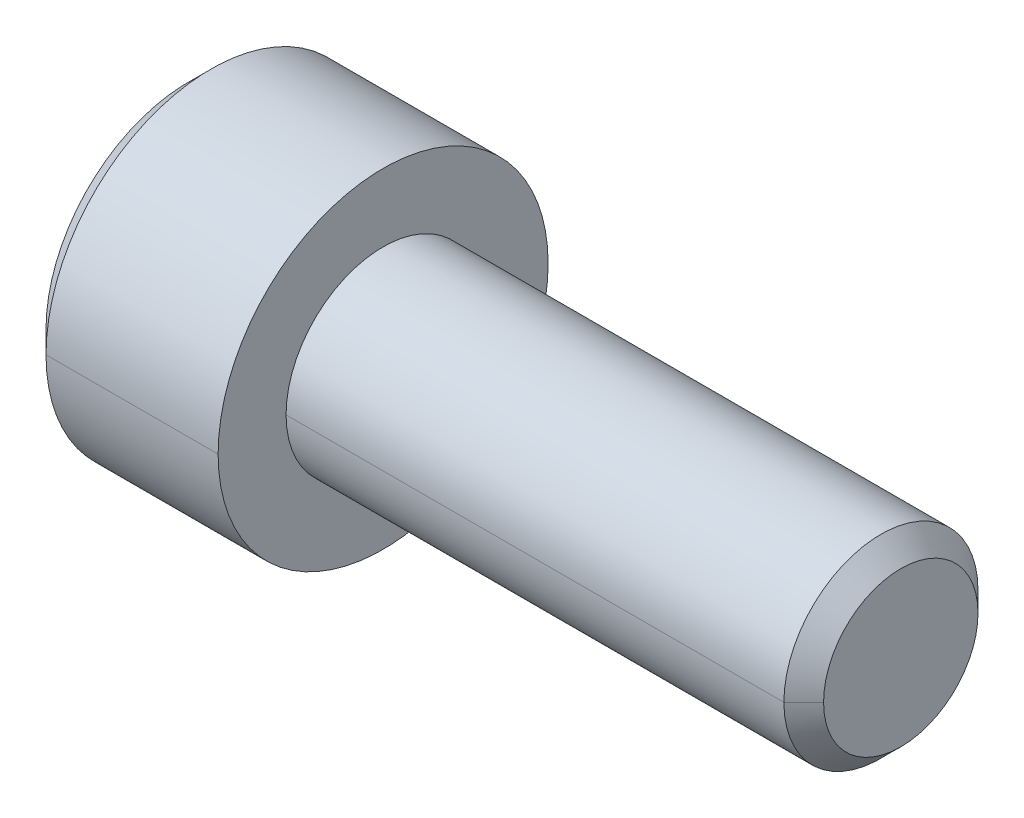
ISO-10303-21;
HEADER;
FILE_DESCRIPTION(('STEP AP214'),'2;1');
FILE_NAME('part.step','',(''),(''),'','','');
FILE_SCHEMA(('AUTOMOTIVE_DESIGN { 1 0 10303 214 1 1 1 1 }'));
ENDSEC;
DATA;
#1=APPLICATION_CONTEXT('core data for automotive mechanical design processes');
#2=APPLICATION_PROTOCOL_DEFINITION('international standard','automotive_design',2000,#1);
#3=PRODUCT_CONTEXT('',#1,'mechanical');
#4=PRODUCT('Part','Part','',(#3));
#5=PRODUCT_RELATED_PRODUCT_CATEGORY('part','',(#4));
#6=PRODUCT_DEFINITION_FORMATION('','',#4);
#7=PRODUCT_DEFINITION_CONTEXT('part definition',#1,'design');
#8=PRODUCT_DEFINITION('design','',#6,#7);
#9=PRODUCT_DEFINITION_SHAPE('','',#8);
#10=(LENGTH_UNIT() NAMED_UNIT(*) SI_UNIT(.MILLI.,.METRE.));
#11=(NAMED_UNIT(*) PLANE_ANGLE_UNIT() SI_UNIT($,.RADIAN.));
#12=(NAMED_UNIT(*) SI_UNIT($,.STERADIAN.) SOLID_ANGLE_UNIT());
#13=UNCERTAINTY_MEASURE_WITH_UNIT(LENGTH_MEASURE(1.E-05),#10,'distance_accuracy_value','');
#14=(GEOMETRIC_REPRESENTATION_CONTEXT(3) GLOBAL_UNCERTAINTY_ASSIGNED_CONTEXT((#13)) GLOBAL_UNIT_ASSIGNED_CONTEXT((#10,
#11,#12)) REPRESENTATION_CONTEXT('',''));
#15=CARTESIAN_POINT('',(0.,0.,0.));
#16=DIRECTION('',(0.,0.,1.));
#17=DIRECTION('',(1.,0.,0.));
#18=AXIS2_PLACEMENT_3D('',#15,#16,#17);
#19=CARTESIAN_POINT('',(-6.,0.,0.));
#20=DIRECTION('',(1.,0.,0.));
#21=DIRECTION('',(0.,0.,-1.));
#22=AXIS2_PLACEMENT_3D('',#19,#20,#21);
#23=PLANE('',#22);
#24=CARTESIAN_POINT('',(-6.,0.,0.));
#25=DIRECTION('',(1.,0.,0.));
#26=DIRECTION('',(0.,0.,-1.));
#27=AXIS2_PLACEMENT_3D('',#24,#25,#26);
#28=CIRCLE('',#27,4.42);
#29=CARTESIAN_POINT('',(-6.,0.,4.42));
#30=VERTEX_POINT('',#29);
#31=CARTESIAN_POINT('',(-6.,0.,-4.42));
#32=VERTEX_POINT('',#31);
#33=EDGE_CURVE('E11',#30,#32,#28,.T.);
#34=ORIENTED_EDGE('',*,*,#33,.F.);
#35=CARTESIAN_POINT('',(-6.,0.,0.));
#36=DIRECTION('',(1.,0.,0.));
#37=DIRECTION('',(0.,0.,-1.));
#38=AXIS2_PLACEMENT_3D('',#35,#36,#37);
#39=CIRCLE('',#38,4.42);
#40=EDGE_CURVE('E25',#32,#30,#39,.T.);
#41=ORIENTED_EDGE('',*,*,#40,.F.);
#42=EDGE_LOOP('',(#34,#41));
#43=FACE_BOUND('',#42,.T.);
#44=DIRECTION('',(0.,0.499999999999983,-0.866025403784448));
#45=VECTOR('',#44,1.);
#46=CARTESIAN_POINT('',(-6.,-2.8867513459481,0.));
#47=LINE('',#46,#45);
#48=CARTESIAN_POINT('',(-6.,-2.8867513459481,0.));
#49=VERTEX_POINT('',#48);
#50=CARTESIAN_POINT('',(-6.,-1.4433756729741,-2.5));
#51=VERTEX_POINT('',#50);
#52=EDGE_CURVE('E353',#49,#51,#47,.T.);
#53=ORIENTED_EDGE('',*,*,#52,.T.);
#54=DIRECTION('',(0.,1.,0.));
#55=VECTOR('',#54,1.);
#56=CARTESIAN_POINT('',(-6.,-1.4433756729741,-2.5));
#57=LINE('',#56,#55);
#58=CARTESIAN_POINT('',(-6.,1.4433756729741,-2.5));
#59=VERTEX_POINT('',#58);
#60=EDGE_CURVE('E349',#51,#59,#57,.T.);
#61=ORIENTED_EDGE('',*,*,#60,.T.);
#62=DIRECTION('',(0.,0.499999999999983,0.866025403784448));
#63=VECTOR('',#62,1.);
#64=CARTESIAN_POINT('',(-6.,1.4433756729741,-2.5));
#65=LINE('',#64,#63);
#66=CARTESIAN_POINT('',(-6.,2.8867513459481,0.));
#67=VERTEX_POINT('',#66);
#68=EDGE_CURVE('E345',#59,#67,#65,.T.);
#69=ORIENTED_EDGE('',*,*,#68,.T.);
#70=DIRECTION('',(0.,-0.499999999999983,0.866025403784448));
#71=VECTOR('',#70,1.);
#72=CARTESIAN_POINT('',(-6.,2.8867513459481,0.));
#73=LINE('',#72,#71);
#74=CARTESIAN_POINT('',(-6.,1.4433756729741,2.5));
#75=VERTEX_POINT('',#74);
#76=EDGE_CURVE('E341',#67,#75,#73,.T.);
#77=ORIENTED_EDGE('',*,*,#76,.T.);
#78=DIRECTION('',(0.,-1.,0.));
#79=VECTOR('',#78,1.);
#80=CARTESIAN_POINT('',(-6.,1.4433756729741,2.5));
#81=LINE('',#80,#79);
#82=CARTESIAN_POINT('',(-6.,-1.4433756729741,2.5));
#83=VERTEX_POINT('',#82);
#84=EDGE_CURVE('E337',#75,#83,#81,.T.);
#85=ORIENTED_EDGE('',*,*,#84,.T.);
#86=DIRECTION('',(0.,-0.499999999999983,-0.866025403784448));
#87=VECTOR('',#86,1.);
#88=CARTESIAN_POINT('',(-6.,-1.4433756729741,2.5));
#89=LINE('',#88,#87);
#90=EDGE_CURVE('E333',#83,#49,#89,.T.);
#91=ORIENTED_EDGE('',*,*,#90,.T.);
#92=EDGE_LOOP('',(#53,#61,#69,#77,#85,#91));
#93=FACE_BOUND('',#92,.T.);
#94=ADVANCED_FACE('F17',(#43,#93),#23,.F.);
#95=CARTESIAN_POINT('',(-3.,-1.4433756729741,2.5));
#96=DIRECTION('',(0.,0.866025403784449,-0.499999999999983));
#97=DIRECTION('',(0.,0.499999999999983,0.866025403784449));
#98=AXIS2_PLACEMENT_3D('',#95,#96,#97);
#99=PLANE('',#98);
#100=ORIENTED_EDGE('',*,*,#90,.F.);
#101=DIRECTION('',(-1.,0.,0.));
#102=VECTOR('',#101,1.);
#103=CARTESIAN_POINT('',(-3.,-1.4433756729741,2.5));
#104=LINE('',#103,#102);
#105=CARTESIAN_POINT('',(-3.,-1.4433756729741,2.5));
#106=VERTEX_POINT('',#105);
#107=EDGE_CURVE('E328',#106,#83,#104,.T.);
#108=ORIENTED_EDGE('',*,*,#107,.F.);
#109=DIRECTION('',(0.,-0.499999999999983,-0.866025403784448));
#110=VECTOR('',#109,1.);
#111=CARTESIAN_POINT('',(-3.,-1.4433756729741,2.5));
#112=LINE('',#111,#110);
#113=CARTESIAN_POINT('',(-3.,-2.16506350946112,1.24999999999996));
#114=VERTEX_POINT('',#113);
#115=EDGE_CURVE('E324',#106,#114,#112,.T.);
#116=ORIENTED_EDGE('',*,*,#115,.T.);
#117=DIRECTION('',(0.,-0.499999999999983,-0.866025403784448));
#118=VECTOR('',#117,1.);
#119=CARTESIAN_POINT('',(-3.,-1.4433756729741,2.5));
#120=LINE('',#119,#118);
#121=CARTESIAN_POINT('',(-3.,-2.8867513459481,0.));
#122=VERTEX_POINT('',#121);
#123=EDGE_CURVE('E320',#114,#122,#120,.T.);
#124=ORIENTED_EDGE('',*,*,#123,.T.);
#125=DIRECTION('',(-1.,0.,0.));
#126=VECTOR('',#125,1.);
#127=CARTESIAN_POINT('',(-3.,-2.8867513459481,0.));
#128=LINE('',#127,#126);
#129=EDGE_CURVE('E315',#122,#49,#128,.T.);
#130=ORIENTED_EDGE('',*,*,#129,.T.);
#131=EDGE_LOOP('',(#100,#108,#116,#124,#130));
#132=FACE_BOUND('',#131,.T.);
#133=ADVANCED_FACE('F387',(#132),#99,.T.);
#134=CARTESIAN_POINT('',(-3.,-2.8867513459481,0.));
#135=DIRECTION('',(0.,0.866025403784449,0.499999999999983));
#136=DIRECTION('',(0.,-0.499999999999983,0.866025403784449));
#137=AXIS2_PLACEMENT_3D('',#134,#135,#136);
#138=PLANE('',#137);
#139=ORIENTED_EDGE('',*,*,#52,.F.);
#140=ORIENTED_EDGE('',*,*,#129,.F.);
#141=DIRECTION('',(0.,0.499999999999983,-0.866025403784448));
#142=VECTOR('',#141,1.);
#143=CARTESIAN_POINT('',(-3.,-2.8867513459481,0.));
#144=LINE('',#143,#142);
#145=CARTESIAN_POINT('',(-3.,-2.16506350946112,-1.24999999999996));
#146=VERTEX_POINT('',#145);
#147=EDGE_CURVE('E311',#122,#146,#144,.T.);
#148=ORIENTED_EDGE('',*,*,#147,.T.);
#149=DIRECTION('',(0.,0.499999999999983,-0.866025403784448));
#150=VECTOR('',#149,1.);
#151=CARTESIAN_POINT('',(-3.,-2.8867513459481,0.));
#152=LINE('',#151,#150);
#153=CARTESIAN_POINT('',(-3.,-1.4433756729741,-2.5));
#154=VERTEX_POINT('',#153);
#155=EDGE_CURVE('E307',#146,#154,#152,.T.);
#156=ORIENTED_EDGE('',*,*,#155,.T.);
#157=DIRECTION('',(-1.,0.,0.));
#158=VECTOR('',#157,1.);
#159=CARTESIAN_POINT('',(-3.,-1.4433756729741,-2.5));
#160=LINE('',#159,#158);
#161=EDGE_CURVE('E302',#154,#51,#160,.T.);
#162=ORIENTED_EDGE('',*,*,#161,.T.);
#163=EDGE_LOOP('',(#139,#140,#148,#156,#162));
#164=FACE_BOUND('',#163,.T.);
#165=ADVANCED_FACE('F391',(#164),#138,.T.);
#166=CARTESIAN_POINT('',(-3.,-1.4433756729741,-2.5));
#167=DIRECTION('',(0.,0.,1.));
#168=DIRECTION('',(1.,0.,0.));
#169=AXIS2_PLACEMENT_3D('',#166,#167,#168);
#170=PLANE('',#169);
#171=ORIENTED_EDGE('',*,*,#60,.F.);
#172=ORIENTED_EDGE('',*,*,#161,.F.);
#173=DIRECTION('',(0.,1.,0.));
#174=VECTOR('',#173,1.);
#175=CARTESIAN_POINT('',(-3.,-1.4433756729741,-2.5));
#176=LINE('',#175,#174);
#177=CARTESIAN_POINT('',(-3.,0.,-2.5));
#178=VERTEX_POINT('',#177);
#179=EDGE_CURVE('E298',#154,#178,#176,.T.);
#180=ORIENTED_EDGE('',*,*,#179,.T.);
#181=DIRECTION('',(0.,1.,0.));
#182=VECTOR('',#181,1.);
#183=CARTESIAN_POINT('',(-3.,-1.4433756729741,-2.5));
#184=LINE('',#183,#182);
#185=CARTESIAN_POINT('',(-3.,1.4433756729741,-2.5));
#186=VERTEX_POINT('',#185);
#187=EDGE_CURVE('E294',#178,#186,#184,.T.);
#188=ORIENTED_EDGE('',*,*,#187,.T.);
#189=DIRECTION('',(-1.,0.,0.));
#190=VECTOR('',#189,1.);
#191=CARTESIAN_POINT('',(-3.,1.4433756729741,-2.5));
#192=LINE('',#191,#190);
#193=EDGE_CURVE('E289',#186,#59,#192,.T.);
#194=ORIENTED_EDGE('',*,*,#193,.T.);
#195=EDGE_LOOP('',(#171,#172,#180,#188,#194));
#196=FACE_BOUND('',#195,.T.);
#197=ADVANCED_FACE('F403',(#196),#170,.T.);
#198=CARTESIAN_POINT('',(-3.,1.4433756729741,-2.5));
#199=DIRECTION('',(0.,-0.866025403784449,0.499999999999983));
#200=DIRECTION('',(0.,-0.499999999999983,-0.866025403784449));
#201=AXIS2_PLACEMENT_3D('',#198,#199,#200);
#202=PLANE('',#201);
#203=ORIENTED_EDGE('',*,*,#68,.F.);
#204=ORIENTED_EDGE('',*,*,#193,.F.);
#205=DIRECTION('',(0.,0.499999999999983,0.866025403784448));
#206=VECTOR('',#205,1.);
#207=CARTESIAN_POINT('',(-3.,1.4433756729741,-2.5));
#208=LINE('',#207,#206);
#209=CARTESIAN_POINT('',(-3.,2.16506350946112,-1.24999999999996));
#210=VERTEX_POINT('',#209);
#211=EDGE_CURVE('E285',#186,#210,#208,.T.);
#212=ORIENTED_EDGE('',*,*,#211,.T.);
#213=DIRECTION('',(0.,0.499999999999983,0.866025403784448));
#214=VECTOR('',#213,1.);
#215=CARTESIAN_POINT('',(-3.,1.4433756729741,-2.5));
#216=LINE('',#215,#214);
#217=CARTESIAN_POINT('',(-3.,2.8867513459481,0.));
#218=VERTEX_POINT('',#217);
#219=EDGE_CURVE('E281',#210,#218,#216,.T.);
#220=ORIENTED_EDGE('',*,*,#219,.T.);
#221=DIRECTION('',(-1.,0.,0.));
#222=VECTOR('',#221,1.);
#223=CARTESIAN_POINT('',(-3.,2.8867513459481,0.));
#224=LINE('',#223,#222);
#225=EDGE_CURVE('E276',#218,#67,#224,.T.);
#226=ORIENTED_EDGE('',*,*,#225,.T.);
#227=EDGE_LOOP('',(#203,#204,#212,#220,#226));
#228=FACE_BOUND('',#227,.T.);
#229=ADVANCED_FACE('F409',(#228),#202,.T.);
#230=CARTESIAN_POINT('',(-3.,2.8867513459481,0.));
#231=DIRECTION('',(0.,-0.866025403784449,-0.499999999999983));
#232=DIRECTION('',(0.,0.499999999999983,-0.866025403784449));
#233=AXIS2_PLACEMENT_3D('',#230,#231,#232);
#234=PLANE('',#233);
#235=ORIENTED_EDGE('',*,*,#76,.F.);
#236=ORIENTED_EDGE('',*,*,#225,.F.);
#237=DIRECTION('',(0.,-0.499999999999983,0.866025403784448));
#238=VECTOR('',#237,1.);
#239=CARTESIAN_POINT('',(-3.,2.8867513459481,0.));
#240=LINE('',#239,#238);
#241=CARTESIAN_POINT('',(-3.,2.16506350946112,1.24999999999996));
#242=VERTEX_POINT('',#241);
#243=EDGE_CURVE('E272',#218,#242,#240,.T.);
#244=ORIENTED_EDGE('',*,*,#243,.T.);
#245=DIRECTION('',(0.,-0.499999999999983,0.866025403784448));
#246=VECTOR('',#245,1.);
#247=CARTESIAN_POINT('',(-3.,2.8867513459481,0.));
#248=LINE('',#247,#246);
#249=CARTESIAN_POINT('',(-3.,1.4433756729741,2.5));
#250=VERTEX_POINT('',#249);
#251=EDGE_CURVE('E268',#242,#250,#248,.T.);
#252=ORIENTED_EDGE('',*,*,#251,.T.);
#253=DIRECTION('',(-1.,0.,0.));
#254=VECTOR('',#253,1.);
#255=CARTESIAN_POINT('',(-3.,1.4433756729741,2.5));
#256=LINE('',#255,#254);
#257=EDGE_CURVE('E263',#250,#75,#256,.T.);
#258=ORIENTED_EDGE('',*,*,#257,.T.);
#259=EDGE_LOOP('',(#235,#236,#244,#252,#258));
#260=FACE_BOUND('',#259,.T.);
#261=ADVANCED_FACE('F415',(#260),#234,.T.);
#262=CARTESIAN_POINT('',(-3.,1.4433756729741,2.5));
#263=DIRECTION('',(0.,0.,-1.));
#264=DIRECTION('',(-1.,0.,0.));
#265=AXIS2_PLACEMENT_3D('',#262,#263,#264);
#266=PLANE('',#265);
#267=ORIENTED_EDGE('',*,*,#84,.F.);
#268=ORIENTED_EDGE('',*,*,#257,.F.);
#269=DIRECTION('',(0.,-1.,0.));
#270=VECTOR('',#269,1.);
#271=CARTESIAN_POINT('',(-3.,1.4433756729741,2.5));
#272=LINE('',#271,#270);
#273=CARTESIAN_POINT('',(-3.,0.,2.5));
#274=VERTEX_POINT('',#273);
#275=EDGE_CURVE('E259',#250,#274,#272,.T.);
#276=ORIENTED_EDGE('',*,*,#275,.T.);
#277=DIRECTION('',(0.,-1.,0.));
#278=VECTOR('',#277,1.);
#279=CARTESIAN_POINT('',(-3.,1.4433756729741,2.5));
#280=LINE('',#279,#278);
#281=EDGE_CURVE('E254',#274,#106,#280,.T.);
#282=ORIENTED_EDGE('',*,*,#281,.T.);
#283=ORIENTED_EDGE('',*,*,#107,.T.);
#284=EDGE_LOOP('',(#267,#268,#276,#282,#283));
#285=FACE_BOUND('',#284,.T.);
#286=ADVANCED_FACE('F419',(#285),#266,.T.);
#287=CARTESIAN_POINT('',(-3.,0.,0.));
#288=DIRECTION('',(1.,0.,0.));
#289=DIRECTION('',(0.,0.,-1.));
#290=AXIS2_PLACEMENT_3D('',#287,#288,#289);
#291=PLANE('',#290);
#292=CARTESIAN_POINT('',(-3.,0.,0.));
#293=DIRECTION('',(1.,0.,0.));
#294=DIRECTION('',(0.,0.,-1.));
#295=AXIS2_PLACEMENT_3D('',#292,#293,#294);
#296=CIRCLE('',#295,2.5);
#297=EDGE_CURVE('E249',#274,#114,#296,.T.);
#298=ORIENTED_EDGE('',*,*,#297,.T.);
#299=ORIENTED_EDGE('',*,*,#115,.F.);
#300=ORIENTED_EDGE('',*,*,#281,.F.);
#301=EDGE_LOOP('',(#298,#299,#300));
#302=FACE_BOUND('',#301,.T.);
#303=ADVANCED_FACE('F460',(#302),#291,.F.);
#304=CARTESIAN_POINT('',(-3.,0.,0.));
#305=DIRECTION('',(-1.,0.,0.));
#306=DIRECTION('',(0.,1.,0.));
#307=AXIS2_PLACEMENT_3D('',#304,#305,#306);
#308=CONICAL_SURFACE('',#307,2.5,1.30899693899575);
#309=DIRECTION('',(-0.258819045102518,0.,-0.965925826289069));
#310=VECTOR('',#309,1.);
#311=CARTESIAN_POINT('',(-2.3301270189222,0.,0.));
#312=LINE('',#311,#310);
#313=CARTESIAN_POINT('',(-2.3301270189222,0.,0.));
#314=VERTEX_POINT('',#313);
#315=EDGE_CURVE('E244',#314,#178,#312,.T.);
#316=ORIENTED_EDGE('',*,*,#315,.T.);
#317=CARTESIAN_POINT('',(-3.,0.,0.));
#318=DIRECTION('',(1.,0.,0.));
#319=DIRECTION('',(0.,0.,-1.));
#320=AXIS2_PLACEMENT_3D('',#317,#318,#319);
#321=CIRCLE('',#320,2.5);
#322=EDGE_CURVE('E239',#146,#178,#321,.T.);
#323=ORIENTED_EDGE('',*,*,#322,.F.);
#324=CARTESIAN_POINT('',(-3.,0.,0.));
#325=DIRECTION('',(1.,0.,0.));
#326=DIRECTION('',(0.,0.,-1.));
#327=AXIS2_PLACEMENT_3D('',#324,#325,#326);
#328=CIRCLE('',#327,2.5);
#329=EDGE_CURVE('E234',#114,#146,#328,.T.);
#330=ORIENTED_EDGE('',*,*,#329,.F.);
#331=ORIENTED_EDGE('',*,*,#297,.F.);
#332=DIRECTION('',(-0.258819045102518,0.,0.965925826289069));
#333=VECTOR('',#332,1.);
#334=CARTESIAN_POINT('',(-2.3301270189222,0.,0.));
#335=LINE('',#334,#333);
#336=EDGE_CURVE('E229',#314,#274,#335,.T.);
#337=ORIENTED_EDGE('',*,*,#336,.F.);
#338=EDGE_LOOP('',(#316,#323,#330,#331,#337));
#339=FACE_BOUND('',#338,.T.);
#340=ADVANCED_FACE('F428',(#339),#308,.F.);
#341=CARTESIAN_POINT('',(-3.,0.,0.));
#342=DIRECTION('',(-1.,0.,0.));
#343=DIRECTION('',(0.,-1.,0.));
#344=AXIS2_PLACEMENT_3D('',#341,#342,#343);
#345=CONICAL_SURFACE('',#344,2.5,1.30899693899575);
#346=ORIENTED_EDGE('',*,*,#336,.T.);
#347=CARTESIAN_POINT('',(-3.,0.,0.));
#348=DIRECTION('',(1.,0.,0.));
#349=DIRECTION('',(0.,0.,-1.));
#350=AXIS2_PLACEMENT_3D('',#347,#348,#349);
#351=CIRCLE('',#350,2.5);
#352=EDGE_CURVE('E224',#242,#274,#351,.T.);
#353=ORIENTED_EDGE('',*,*,#352,.F.);
#354=CARTESIAN_POINT('',(-3.,0.,0.));
#355=DIRECTION('',(1.,0.,0.));
#356=DIRECTION('',(0.,0.,-1.));
#357=AXIS2_PLACEMENT_3D('',#354,#355,#356);
#358=CIRCLE('',#357,2.5);
#359=EDGE_CURVE('E219',#210,#242,#358,.T.);
#360=ORIENTED_EDGE('',*,*,#359,.F.);
#361=CARTESIAN_POINT('',(-3.,0.,0.));
#362=DIRECTION('',(1.,0.,0.));
#363=DIRECTION('',(0.,0.,-1.));
#364=AXIS2_PLACEMENT_3D('',#361,#362,#363);
#365=CIRCLE('',#364,2.5);
#366=EDGE_CURVE('E214',#178,#210,#365,.T.);
#367=ORIENTED_EDGE('',*,*,#366,.F.);
#368=ORIENTED_EDGE('',*,*,#315,.F.);
#369=EDGE_LOOP('',(#346,#353,#360,#367,#368));
#370=FACE_BOUND('',#369,.T.);
#371=ADVANCED_FACE('F453',(#370),#345,.F.);
#372=CARTESIAN_POINT('',(-3.,0.,0.));
#373=DIRECTION('',(1.,0.,0.));
#374=DIRECTION('',(0.,0.,-1.));
#375=AXIS2_PLACEMENT_3D('',#372,#373,#374);
#376=PLANE('',#375);
#377=ORIENTED_EDGE('',*,*,#366,.T.);
#378=ORIENTED_EDGE('',*,*,#211,.F.);
#379=ORIENTED_EDGE('',*,*,#187,.F.);
#380=EDGE_LOOP('',(#377,#378,#379));
#381=FACE_BOUND('',#380,.T.);
#382=ADVANCED_FACE('F449',(#381),#376,.F.);
#383=CARTESIAN_POINT('',(-3.,0.,0.));
#384=DIRECTION('',(1.,0.,0.));
#385=DIRECTION('',(0.,0.,-1.));
#386=AXIS2_PLACEMENT_3D('',#383,#384,#385);
#387=PLANE('',#386);
#388=ORIENTED_EDGE('',*,*,#219,.F.);
#389=ORIENTED_EDGE('',*,*,#359,.T.);
#390=ORIENTED_EDGE('',*,*,#243,.F.);
#391=EDGE_LOOP('',(#388,#389,#390));
#392=FACE_BOUND('',#391,.T.);
#393=ADVANCED_FACE('F442',(#392),#387,.F.);
#394=CARTESIAN_POINT('',(-3.,0.,0.));
#395=DIRECTION('',(1.,0.,0.));
#396=DIRECTION('',(0.,0.,-1.));
#397=AXIS2_PLACEMENT_3D('',#394,#395,#396);
#398=PLANE('',#397);
#399=ORIENTED_EDGE('',*,*,#352,.T.);
#400=ORIENTED_EDGE('',*,*,#275,.F.);
#401=ORIENTED_EDGE('',*,*,#251,.F.);
#402=EDGE_LOOP('',(#399,#400,#401));
#403=FACE_BOUND('',#402,.T.);
#404=ADVANCED_FACE('F435',(#403),#398,.F.);
#405=CARTESIAN_POINT('',(-3.,0.,0.));
#406=DIRECTION('',(1.,0.,0.));
#407=DIRECTION('',(0.,0.,-1.));
#408=AXIS2_PLACEMENT_3D('',#405,#406,#407);
#409=PLANE('',#408);
#410=ORIENTED_EDGE('',*,*,#329,.T.);
#411=ORIENTED_EDGE('',*,*,#147,.F.);
#412=ORIENTED_EDGE('',*,*,#123,.F.);
#413=EDGE_LOOP('',(#410,#411,#412));
#414=FACE_BOUND('',#413,.T.);
#415=ADVANCED_FACE('F433',(#414),#409,.F.);
#416=CARTESIAN_POINT('',(-3.,0.,0.));
#417=DIRECTION('',(1.,0.,0.));
#418=DIRECTION('',(0.,0.,-1.));
#419=AXIS2_PLACEMENT_3D('',#416,#417,#418);
#420=PLANE('',#419);
#421=ORIENTED_EDGE('',*,*,#322,.T.);
#422=ORIENTED_EDGE('',*,*,#179,.F.);
#423=ORIENTED_EDGE('',*,*,#155,.F.);
#424=EDGE_LOOP('',(#421,#422,#423));
#425=FACE_BOUND('',#424,.T.);
#426=ADVANCED_FACE('F432',(#425),#420,.F.);
#427=CARTESIAN_POINT('',(-6.,0.,0.));
#428=DIRECTION('',(1.,0.,0.));
#429=DIRECTION('',(0.,-1.,0.));
#430=AXIS2_PLACEMENT_3D('',#427,#428,#429);
#431=CONICAL_SURFACE('',#430,4.42,0.785398163397448);
#432=DIRECTION('',(0.707106781186548,0.,0.707106781186547));
#433=VECTOR('',#432,1.);
#434=CARTESIAN_POINT('',(-6.,0.,4.42));
#435=LINE('',#434,#433);
#436=CARTESIAN_POINT('',(-5.32,0.,5.1));
#437=VERTEX_POINT('',#436);
#438=EDGE_CURVE('E210',#30,#437,#435,.T.);
#439=ORIENTED_EDGE('',*,*,#438,.T.);
#440=CARTESIAN_POINT('',(-5.32,0.,0.));
#441=DIRECTION('',(1.,0.,0.));
#442=DIRECTION('',(0.,0.,-1.));
#443=AXIS2_PLACEMENT_3D('',#440,#441,#442);
#444=CIRCLE('',#443,5.1);
#445=CARTESIAN_POINT('',(-5.32,0.,-5.1));
#446=VERTEX_POINT('',#445);
#447=EDGE_CURVE('E205',#446,#437,#444,.T.);
#448=ORIENTED_EDGE('',*,*,#447,.F.);
#449=DIRECTION('',(0.707106781186548,0.,-0.707106781186547));
#450=VECTOR('',#449,1.);
#451=CARTESIAN_POINT('',(-6.,0.,-4.42));
#452=LINE('',#451,#450);
#453=EDGE_CURVE('E200',#32,#446,#452,.T.);
#454=ORIENTED_EDGE('',*,*,#453,.F.);
#455=ORIENTED_EDGE('',*,*,#40,.T.);
#456=EDGE_LOOP('',(#439,#448,#454,#455));
#457=FACE_BOUND('',#456,.T.);
#458=ADVANCED_FACE('F362',(#457),#431,.T.);
#459=CARTESIAN_POINT('',(-6.,0.,0.));
#460=DIRECTION('',(1.,0.,0.));
#461=DIRECTION('',(0.,1.,0.));
#462=AXIS2_PLACEMENT_3D('',#459,#460,#461);
#463=CONICAL_SURFACE('',#462,4.42,0.785398163397448);
#464=ORIENTED_EDGE('',*,*,#438,.F.);
#465=ORIENTED_EDGE('',*,*,#33,.T.);
#466=ORIENTED_EDGE('',*,*,#453,.T.);
#467=CARTESIAN_POINT('',(-5.32,0.,0.));
#468=DIRECTION('',(1.,0.,0.));
#469=DIRECTION('',(0.,0.,-1.));
#470=AXIS2_PLACEMENT_3D('',#467,#468,#469);
#471=CIRCLE('',#470,5.1);
#472=EDGE_CURVE('E195',#437,#446,#471,.T.);
#473=ORIENTED_EDGE('',*,*,#472,.F.);
#474=EDGE_LOOP('',(#464,#465,#466,#473));
#475=FACE_BOUND('',#474,.T.);
#476=ADVANCED_FACE('F365',(#475),#463,.T.);
#477=CARTESIAN_POINT('',(16.,0.,0.));
#478=DIRECTION('',(1.,0.,0.));
#479=DIRECTION('',(0.,1.,0.));
#480=AXIS2_PLACEMENT_3D('',#477,#478,#479);
#481=CYLINDRICAL_SURFACE('',#480,5.1);
#482=DIRECTION('',(1.,0.,0.));
#483=VECTOR('',#482,1.);
#484=CARTESIAN_POINT('',(-5.32,0.,5.1));
#485=LINE('',#484,#483);
#486=CARTESIAN_POINT('',(0.,0.,5.1));
#487=VERTEX_POINT('',#486);
#488=EDGE_CURVE('E190',#437,#487,#485,.T.);
#489=ORIENTED_EDGE('',*,*,#488,.F.);
#490=ORIENTED_EDGE('',*,*,#472,.T.);
#491=DIRECTION('',(1.,0.,0.));
#492=VECTOR('',#491,1.);
#493=CARTESIAN_POINT('',(-5.32,0.,-5.1));
#494=LINE('',#493,#492);
#495=CARTESIAN_POINT('',(0.,0.,-5.1));
#496=VERTEX_POINT('',#495);
#497=EDGE_CURVE('E186',#446,#496,#494,.T.);
#498=ORIENTED_EDGE('',*,*,#497,.T.);
#499=CARTESIAN_POINT('',(0.,0.,0.));
#500=DIRECTION('',(1.,0.,0.));
#501=DIRECTION('',(0.,0.,-1.));
#502=AXIS2_PLACEMENT_3D('',#499,#500,#501);
#503=CIRCLE('',#502,5.1);
#504=EDGE_CURVE('E181',#487,#496,#503,.T.);
#505=ORIENTED_EDGE('',*,*,#504,.F.);
#506=EDGE_LOOP('',(#489,#490,#498,#505));
#507=FACE_BOUND('',#506,.T.);
#508=ADVANCED_FACE('F369',(#507),#481,.T.);
#509=CARTESIAN_POINT('',(0.,5.1,0.));
#510=DIRECTION('',(-1.,0.,0.));
#511=DIRECTION('',(0.,0.,1.));
#512=AXIS2_PLACEMENT_3D('',#509,#510,#511);
#513=PLANE('',#512);
#514=CARTESIAN_POINT('',(0.,0.,0.));
#515=DIRECTION('',(1.,0.,0.));
#516=DIRECTION('',(0.,0.,-1.));
#517=AXIS2_PLACEMENT_3D('',#514,#515,#516);
#518=CIRCLE('',#517,3.);
#519=CARTESIAN_POINT('',(0.,0.,3.));
#520=VERTEX_POINT('',#519);
#521=CARTESIAN_POINT('',(0.,0.,-3.));
#522=VERTEX_POINT('',#521);
#523=EDGE_CURVE('E176',#520,#522,#518,.T.);
#524=ORIENTED_EDGE('',*,*,#523,.F.);
#525=CARTESIAN_POINT('',(0.,0.,0.));
#526=DIRECTION('',(1.,0.,0.));
#527=DIRECTION('',(0.,0.,-1.));
#528=AXIS2_PLACEMENT_3D('',#525,#526,#527);
#529=CIRCLE('',#528,3.);
#530=EDGE_CURVE('E171',#522,#520,#529,.T.);
#531=ORIENTED_EDGE('',*,*,#530,.F.);
#532=EDGE_LOOP('',(#524,#531));
#533=FACE_BOUND('',#532,.T.);
#534=CARTESIAN_POINT('',(0.,0.,0.));
#535=DIRECTION('',(1.,0.,0.));
#536=DIRECTION('',(0.,0.,-1.));
#537=AXIS2_PLACEMENT_3D('',#534,#535,#536);
#538=CIRCLE('',#537,5.1);
#539=EDGE_CURVE('E166',#496,#487,#538,.T.);
#540=ORIENTED_EDGE('',*,*,#539,.T.);
#541=ORIENTED_EDGE('',*,*,#504,.T.);
#542=EDGE_LOOP('',(#540,#541));
#543=FACE_BOUND('',#542,.T.);
#544=ADVANCED_FACE('F374',(#533,#543),#513,.F.);
#545=CARTESIAN_POINT('',(16.,0.,0.));
#546=DIRECTION('',(1.,0.,0.));
#547=DIRECTION('',(0.,-1.,0.));
#548=AXIS2_PLACEMENT_3D('',#545,#546,#547);
#549=CYLINDRICAL_SURFACE('',#548,5.1);
#550=ORIENTED_EDGE('',*,*,#488,.T.);
#551=ORIENTED_EDGE('',*,*,#539,.F.);
#552=ORIENTED_EDGE('',*,*,#497,.F.);
#553=ORIENTED_EDGE('',*,*,#447,.T.);
#554=EDGE_LOOP('',(#550,#551,#552,#553));
#555=FACE_BOUND('',#554,.T.);
#556=ADVANCED_FACE('F372',(#555),#549,.T.);
#557=CARTESIAN_POINT('',(16.,0.,0.));
#558=DIRECTION('',(1.,0.,0.));
#559=DIRECTION('',(0.,-1.,0.));
#560=AXIS2_PLACEMENT_3D('',#557,#558,#559);
#561=CYLINDRICAL_SURFACE('',#560,3.);
#562=DIRECTION('',(1.,0.,0.));
#563=VECTOR('',#562,1.);
#564=CARTESIAN_POINT('',(0.,0.,3.));
#565=LINE('',#564,#563);
#566=CARTESIAN_POINT('',(15.3865,0.,3.));
#567=VERTEX_POINT('',#566);
#568=EDGE_CURVE('E162',#520,#567,#565,.T.);
#569=ORIENTED_EDGE('',*,*,#568,.T.);
#570=CARTESIAN_POINT('',(15.3865,0.,0.));
#571=DIRECTION('',(1.,0.,0.));
#572=DIRECTION('',(0.,0.,-1.));
#573=AXIS2_PLACEMENT_3D('',#570,#571,#572);
#574=CIRCLE('',#573,3.);
#575=CARTESIAN_POINT('',(15.3865,0.,-3.));
#576=VERTEX_POINT('',#575);
#577=EDGE_CURVE('E140',#576,#567,#574,.T.);
#578=ORIENTED_EDGE('',*,*,#577,.F.);
#579=DIRECTION('',(1.,0.,0.));
#580=VECTOR('',#579,1.);
#581=CARTESIAN_POINT('',(0.,0.,-3.));
#582=LINE('',#581,#580);
#583=EDGE_CURVE('E154',#522,#576,#582,.T.);
#584=ORIENTED_EDGE('',*,*,#583,.F.);
#585=ORIENTED_EDGE('',*,*,#530,.T.);
#586=EDGE_LOOP('',(#569,#578,#584,#585));
#587=FACE_BOUND('',#586,.T.);
#588=ADVANCED_FACE('F383',(#587),#561,.T.);
#589=CARTESIAN_POINT('',(16.,0.,0.));
#590=DIRECTION('',(1.,0.,0.));
#591=DIRECTION('',(0.,1.,-1.61702901641324E-09));
#592=AXIS2_PLACEMENT_3D('',#589,#590,#591);
#593=CYLINDRICAL_SURFACE('',#592,3.);
#594=ORIENTED_EDGE('',*,*,#568,.F.);
#595=ORIENTED_EDGE('',*,*,#523,.T.);
#596=ORIENTED_EDGE('',*,*,#583,.T.);
#597=CARTESIAN_POINT('',(15.3865,0.,0.));
#598=DIRECTION('',(1.,0.,0.));
#599=DIRECTION('',(0.,0.,-1.));
#600=AXIS2_PLACEMENT_3D('',#597,#598,#599);
#601=CIRCLE('',#600,3.);
#602=EDGE_CURVE('E150',#567,#576,#601,.T.);
#603=ORIENTED_EDGE('',*,*,#602,.F.);
#604=EDGE_LOOP('',(#594,#595,#596,#603));
#605=FACE_BOUND('',#604,.T.);
#606=ADVANCED_FACE('F580',(#605),#593,.T.);
#607=CARTESIAN_POINT('',(15.3865,0.,0.));
#608=DIRECTION('',(-1.,0.,0.));
#609=DIRECTION('',(0.,1.,0.));
#610=AXIS2_PLACEMENT_3D('',#607,#608,#609);
#611=CONICAL_SURFACE('',#610,3.,0.785398163397449);
#612=DIRECTION('',(-0.707106781186548,0.,-0.707106781186548));
#613=VECTOR('',#612,1.);
#614=CARTESIAN_POINT('',(16.,0.,-2.3865));
#615=LINE('',#614,#613);
#616=CARTESIAN_POINT('',(16.,0.,-2.3865));
#617=VERTEX_POINT('',#616);
#618=EDGE_CURVE('E131',#617,#576,#615,.T.);
#619=ORIENTED_EDGE('',*,*,#618,.F.);
#620=CARTESIAN_POINT('',(16.,0.,0.));
#621=DIRECTION('',(1.,0.,0.));
#622=DIRECTION('',(0.,0.,-1.));
#623=AXIS2_PLACEMENT_3D('',#620,#621,#622);
#624=CIRCLE('',#623,2.3865);
#625=CARTESIAN_POINT('',(16.,0.,2.3865));
#626=VERTEX_POINT('',#625);
#627=EDGE_CURVE('E123',#626,#617,#624,.T.);
#628=ORIENTED_EDGE('',*,*,#627,.F.);
#629=DIRECTION('',(-0.707106781186548,0.,0.707106781186548));
#630=VECTOR('',#629,1.);
#631=CARTESIAN_POINT('',(16.,0.,2.3865));
#632=LINE('',#631,#630);
#633=EDGE_CURVE('E128',#626,#567,#632,.T.);
#634=ORIENTED_EDGE('',*,*,#633,.T.);
#635=ORIENTED_EDGE('',*,*,#602,.T.);
#636=EDGE_LOOP('',(#619,#628,#634,#635));
#637=FACE_BOUND('',#636,.T.);
#638=ADVANCED_FACE('F125',(#637),#611,.T.);
#639=CARTESIAN_POINT('',(15.3865,0.,0.));
#640=DIRECTION('',(-1.,0.,0.));
#641=DIRECTION('',(0.,-1.,0.));
#642=AXIS2_PLACEMENT_3D('',#639,#640,#641);
#643=CONICAL_SURFACE('',#642,3.,0.785398163397449);
#644=ORIENTED_EDGE('',*,*,#618,.T.);
#645=ORIENTED_EDGE('',*,*,#577,.T.);
#646=ORIENTED_EDGE('',*,*,#633,.F.);
#647=CARTESIAN_POINT('',(16.,0.,0.));
#648=DIRECTION('',(1.,0.,0.));
#649=DIRECTION('',(0.,0.,-1.));
#650=AXIS2_PLACEMENT_3D('',#647,#648,#649);
#651=CIRCLE('',#650,2.3865);
#652=EDGE_CURVE('E135',#617,#626,#651,.T.);
#653=ORIENTED_EDGE('',*,*,#652,.F.);
#654=EDGE_LOOP('',(#644,#645,#646,#653));
#655=FACE_BOUND('',#654,.T.);
#656=ADVANCED_FACE('F139',(#655),#643,.T.);
#657=CARTESIAN_POINT('',(16.,2.3865,0.));
#658=DIRECTION('',(-1.,0.,0.));
#659=DIRECTION('',(0.,0.,1.));
#660=AXIS2_PLACEMENT_3D('',#657,#658,#659);
#661=PLANE('',#660);
#662=ORIENTED_EDGE('',*,*,#652,.T.);
#663=ORIENTED_EDGE('',*,*,#627,.T.);
#664=EDGE_LOOP('',(#662,#663));
#665=FACE_BOUND('',#664,.T.);
#666=ADVANCED_FACE('F136',(#665),#661,.F.);
#667=CLOSED_SHELL('',(#94,#133,#165,#197,#229,#261,#286,#303,#340,#371,#382,#393,#404,#415,#426,
#458,#476,#508,#544,#556,#588,#606,#638,#656,#666));
#668=MANIFOLD_SOLID_BREP('B1',#667);
#669=ADVANCED_BREP_SHAPE_REPRESENTATION('',(#18,#668),#14);
#670=SHAPE_DEFINITION_REPRESENTATION(#9,#669);
ENDSEC;
END-ISO-10303-21;
